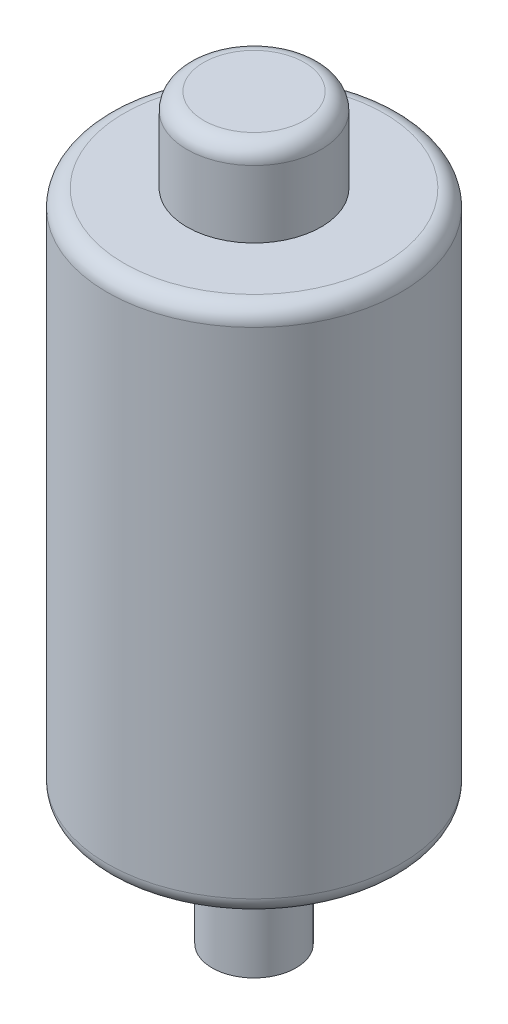
ISO-10303-21;
HEADER;
FILE_DESCRIPTION(('STEP AP214'),'2;1');
FILE_NAME('part.step','',(''),(''),'','','');
FILE_SCHEMA(('AUTOMOTIVE_DESIGN { 1 0 10303 214 1 1 1 1 }'));
ENDSEC;
DATA;
#1=APPLICATION_CONTEXT('core data for automotive mechanical design processes');
#2=APPLICATION_PROTOCOL_DEFINITION('international standard','automotive_design',2000,#1);
#3=PRODUCT_CONTEXT('',#1,'mechanical');
#4=PRODUCT('Part','Part','',(#3));
#5=PRODUCT_RELATED_PRODUCT_CATEGORY('part','',(#4));
#6=PRODUCT_DEFINITION_FORMATION('','',#4);
#7=PRODUCT_DEFINITION_CONTEXT('part definition',#1,'design');
#8=PRODUCT_DEFINITION('design','',#6,#7);
#9=PRODUCT_DEFINITION_SHAPE('','',#8);
#10=(LENGTH_UNIT() NAMED_UNIT(*) SI_UNIT(.MILLI.,.METRE.));
#11=(NAMED_UNIT(*) PLANE_ANGLE_UNIT() SI_UNIT($,.RADIAN.));
#12=(NAMED_UNIT(*) SI_UNIT($,.STERADIAN.) SOLID_ANGLE_UNIT());
#13=UNCERTAINTY_MEASURE_WITH_UNIT(LENGTH_MEASURE(1.E-05),#10,'distance_accuracy_value','');
#14=(GEOMETRIC_REPRESENTATION_CONTEXT(3) GLOBAL_UNCERTAINTY_ASSIGNED_CONTEXT((#13)) GLOBAL_UNIT_ASSIGNED_CONTEXT((#10,
#11,#12)) REPRESENTATION_CONTEXT('',''));
#15=CARTESIAN_POINT('',(0.,0.,0.));
#16=DIRECTION('',(0.,0.,1.));
#17=DIRECTION('',(1.,0.,0.));
#18=AXIS2_PLACEMENT_3D('',#15,#16,#17);
#19=CARTESIAN_POINT('',(0.,99.06,0.));
#20=DIRECTION('',(0.,1.,0.));
#21=DIRECTION('',(0.,0.,1.));
#22=AXIS2_PLACEMENT_3D('',#19,#20,#21);
#23=PLANE('',#22);
#24=CARTESIAN_POINT('',(0.,99.06,0.));
#25=DIRECTION('',(0.,1.,0.));
#26=DIRECTION('',(0.,0.,1.));
#27=AXIS2_PLACEMENT_3D('',#24,#25,#26);
#28=CIRCLE('',#27,19.685);
#29=CARTESIAN_POINT('',(0.,99.06,19.685));
#30=VERTEX_POINT('',#29);
#31=EDGE_CURVE('E55',#30,#30,#28,.T.);
#32=ORIENTED_EDGE('',*,*,#31,.T.);
#33=EDGE_LOOP('',(#32));
#34=FACE_BOUND('',#33,.T.);
#35=CARTESIAN_POINT('',(0.,99.06,0.));
#36=DIRECTION('',(0.,1.,0.));
#37=DIRECTION('',(0.,0.,1.));
#38=AXIS2_PLACEMENT_3D('',#35,#36,#37);
#39=CIRCLE('',#38,10.16);
#40=CARTESIAN_POINT('',(0.,99.06,10.16));
#41=VERTEX_POINT('',#40);
#42=EDGE_CURVE('E68',#41,#41,#39,.T.);
#43=ORIENTED_EDGE('',*,*,#42,.F.);
#44=EDGE_LOOP('',(#43));
#45=FACE_BOUND('',#44,.T.);
#46=ADVANCED_FACE('F31',(#34,#45),#23,.T.);
#47=CARTESIAN_POINT('',(0.,19.05,0.));
#48=DIRECTION('',(0.,-1.,0.));
#49=DIRECTION('',(0.,0.,-1.));
#50=AXIS2_PLACEMENT_3D('',#47,#48,#49);
#51=CYLINDRICAL_SURFACE('',#50,6.35);
#52=CARTESIAN_POINT('',(0.,19.05,0.));
#53=DIRECTION('',(0.,1.,0.));
#54=DIRECTION('',(0.,0.,1.));
#55=AXIS2_PLACEMENT_3D('',#52,#53,#54);
#56=CIRCLE('',#55,6.35);
#57=CARTESIAN_POINT('',(0.,19.05,-6.35));
#58=VERTEX_POINT('',#57);
#59=EDGE_CURVE('E64',#58,#58,#56,.T.);
#60=CARTESIAN_POINT('',(0.,0.,0.));
#61=DIRECTION('',(0.,1.,0.));
#62=DIRECTION('',(0.,0.,1.));
#63=AXIS2_PLACEMENT_3D('',#60,#61,#62);
#64=CIRCLE('',#63,6.35);
#65=CARTESIAN_POINT('',(0.,0.,-6.35));
#66=VERTEX_POINT('',#65);
#67=EDGE_CURVE('E65',#66,#66,#64,.T.);
#68=CARTESIAN_POINT('',(0.,19.05,-6.35));
#69=CARTESIAN_POINT('',(0.,18.8515625,-6.35));
#70=CARTESIAN_POINT('',(0.,18.653125,-6.35));
#71=CARTESIAN_POINT('',(0.,18.25625,-6.35));
#72=CARTESIAN_POINT('',(0.,18.0578125,-6.35));
#73=CARTESIAN_POINT('',(0.,17.6609375,-6.35));
#74=CARTESIAN_POINT('',(0.,17.4625,-6.35));
#75=CARTESIAN_POINT('',(0.,17.065625,-6.35));
#76=CARTESIAN_POINT('',(0.,16.8671875,-6.35));
#77=CARTESIAN_POINT('',(0.,16.4703125,-6.35));
#78=CARTESIAN_POINT('',(0.,16.271875,-6.35));
#79=CARTESIAN_POINT('',(0.,15.875,-6.35));
#80=CARTESIAN_POINT('',(0.,15.6765625,-6.35));
#81=CARTESIAN_POINT('',(0.,15.2796875,-6.35));
#82=CARTESIAN_POINT('',(0.,15.08125,-6.35));
#83=CARTESIAN_POINT('',(0.,14.684375,-6.35));
#84=CARTESIAN_POINT('',(0.,14.4859375,-6.35));
#85=CARTESIAN_POINT('',(0.,14.0890625,-6.35));
#86=CARTESIAN_POINT('',(0.,13.890625,-6.35));
#87=CARTESIAN_POINT('',(0.,13.49375,-6.35));
#88=CARTESIAN_POINT('',(0.,13.2953125,-6.35));
#89=CARTESIAN_POINT('',(0.,12.8984375,-6.35));
#90=CARTESIAN_POINT('',(0.,12.7,-6.35));
#91=CARTESIAN_POINT('',(0.,12.303125,-6.35));
#92=CARTESIAN_POINT('',(0.,12.1046875,-6.35));
#93=CARTESIAN_POINT('',(0.,11.7078125,-6.35));
#94=CARTESIAN_POINT('',(0.,11.509375,-6.35));
#95=CARTESIAN_POINT('',(0.,11.1125,-6.35));
#96=CARTESIAN_POINT('',(0.,10.9140625,-6.35));
#97=CARTESIAN_POINT('',(0.,10.5171875,-6.35));
#98=CARTESIAN_POINT('',(0.,10.31875,-6.35));
#99=CARTESIAN_POINT('',(0.,9.921875,-6.35));
#100=CARTESIAN_POINT('',(0.,9.7234375,-6.35));
#101=CARTESIAN_POINT('',(0.,9.3265625,-6.35));
#102=CARTESIAN_POINT('',(0.,9.128125,-6.35));
#103=CARTESIAN_POINT('',(0.,8.73125,-6.35));
#104=CARTESIAN_POINT('',(0.,8.5328125,-6.35));
#105=CARTESIAN_POINT('',(0.,8.1359375,-6.35));
#106=CARTESIAN_POINT('',(0.,7.9375,-6.35));
#107=CARTESIAN_POINT('',(0.,7.540625,-6.35));
#108=CARTESIAN_POINT('',(0.,7.3421875,-6.35));
#109=CARTESIAN_POINT('',(0.,6.9453125,-6.35));
#110=CARTESIAN_POINT('',(0.,6.746875,-6.35));
#111=CARTESIAN_POINT('',(0.,6.35,-6.35));
#112=CARTESIAN_POINT('',(0.,6.1515625,-6.35));
#113=CARTESIAN_POINT('',(0.,5.7546875,-6.35));
#114=CARTESIAN_POINT('',(0.,5.55625,-6.35));
#115=CARTESIAN_POINT('',(0.,5.159375,-6.35));
#116=CARTESIAN_POINT('',(0.,4.9609375,-6.35));
#117=CARTESIAN_POINT('',(0.,4.5640625,-6.35));
#118=CARTESIAN_POINT('',(0.,4.365625,-6.35));
#119=CARTESIAN_POINT('',(0.,3.96875,-6.35));
#120=CARTESIAN_POINT('',(0.,3.7703125,-6.35));
#121=CARTESIAN_POINT('',(0.,3.3734375,-6.35));
#122=CARTESIAN_POINT('',(0.,3.175,-6.35));
#123=CARTESIAN_POINT('',(0.,2.778125,-6.35));
#124=CARTESIAN_POINT('',(0.,2.5796875,-6.35));
#125=CARTESIAN_POINT('',(0.,2.1828125,-6.35));
#126=CARTESIAN_POINT('',(0.,1.984375,-6.35));
#127=CARTESIAN_POINT('',(0.,1.5875,-6.35));
#128=CARTESIAN_POINT('',(0.,1.3890625,-6.35));
#129=CARTESIAN_POINT('',(0.,0.992187500000001,-6.35));
#130=CARTESIAN_POINT('',(0.,0.793750000000001,-6.35));
#131=CARTESIAN_POINT('',(0.,0.396875,-6.35));
#132=CARTESIAN_POINT('',(0.,0.1984375,-6.35));
#133=CARTESIAN_POINT('',(0.,0.,-6.35));
#134=B_SPLINE_CURVE_WITH_KNOTS('',3,(#68,#69,#70,#71,#72,#73,#74,#75,#76,#77,#78,#79,#80,#81,
#82,#83,#84,#85,#86,#87,#88,#89,#90,#91,#92,#93,#94,#95,#96,#97,#98,#99,#100,#101,#102,#103,
#104,#105,#106,#107,#108,#109,#110,#111,#112,#113,#114,#115,#116,#117,#118,#119,#120,#121,#122,
#123,#124,#125,#126,#127,#128,#129,#130,#131,#132,#133),.UNSPECIFIED.,.F.,.F.,(4,2,2,2,2,2,2,2,
2,2,2,2,2,2,2,2,2,2,2,2,2,2,2,2,2,2,2,2,2,2,2,2,4),(0.,0.5953125,1.190625,1.7859375,2.38125,
2.9765625,3.571875,4.1671875,4.7625,5.3578125,5.953125,6.5484375,7.14375,7.7390625,8.334375,
8.9296875,9.525,10.1203125,10.715625,11.3109375,11.90625,12.5015625,13.096875,13.6921875,
14.2875,14.8828125,15.478125,16.0734375,16.66875,17.2640625,17.859375,18.4546875,19.05),.UNSPECIFIED.);
#135=EDGE_CURVE('BSEAM92',#58,#66,#134,.T.);
#136=ORIENTED_EDGE('',*,*,#59,.F.);
#137=ORIENTED_EDGE('',*,*,#67,.T.);
#138=ORIENTED_EDGE('',*,*,#135,.T.);
#139=ORIENTED_EDGE('',*,*,#135,.F.);
#140=EDGE_LOOP('',(#136,#138,#137,#139));
#141=FACE_BOUND('',#140,.T.);
#142=ADVANCED_FACE('F92',(#141),#51,.T.);
#143=CARTESIAN_POINT('',(0.,0.,0.));
#144=DIRECTION('',(0.,1.,0.));
#145=DIRECTION('',(0.,0.,1.));
#146=AXIS2_PLACEMENT_3D('',#143,#144,#145);
#147=PLANE('',#146);
#148=ORIENTED_EDGE('',*,*,#67,.F.);
#149=EDGE_LOOP('',(#148));
#150=FACE_BOUND('',#149,.T.);
#151=ADVANCED_FACE('F98',(#150),#147,.F.);
#152=CARTESIAN_POINT('',(0.,19.05,0.));
#153=DIRECTION('',(0.,1.,0.));
#154=DIRECTION('',(0.,0.,1.));
#155=AXIS2_PLACEMENT_3D('',#152,#153,#154);
#156=PLANE('',#155);
#157=CARTESIAN_POINT('',(0.,19.05,0.));
#158=DIRECTION('',(0.,1.,0.));
#159=DIRECTION('',(0.,0.,1.));
#160=AXIS2_PLACEMENT_3D('',#157,#158,#159);
#161=CIRCLE('',#160,19.685);
#162=CARTESIAN_POINT('',(0.,19.05,19.685));
#163=VERTEX_POINT('',#162);
#164=EDGE_CURVE('E42',#163,#163,#161,.F.);
#165=ORIENTED_EDGE('',*,*,#164,.T.);
#166=EDGE_LOOP('',(#165));
#167=FACE_BOUND('',#166,.T.);
#168=ORIENTED_EDGE('',*,*,#59,.T.);
#169=EDGE_LOOP('',(#168));
#170=FACE_BOUND('',#169,.T.);
#171=ADVANCED_FACE('F105',(#167,#170),#156,.F.);
#172=CARTESIAN_POINT('',(0.,99.06,0.));
#173=DIRECTION('',(0.,-1.,0.));
#174=DIRECTION('',(0.,0.,-1.));
#175=AXIS2_PLACEMENT_3D('',#172,#173,#174);
#176=CYLINDRICAL_SURFACE('',#175,22.225);
#177=CARTESIAN_POINT('',(0.,21.59,0.));
#178=DIRECTION('',(0.,1.,0.));
#179=DIRECTION('',(0.,0.,1.));
#180=AXIS2_PLACEMENT_3D('',#177,#178,#179);
#181=CIRCLE('',#180,22.225);
#182=CARTESIAN_POINT('',(0.,21.59,22.225));
#183=VERTEX_POINT('',#182);
#184=EDGE_CURVE('E46',#183,#183,#181,.T.);
#185=ORIENTED_EDGE('',*,*,#184,.T.);
#186=EDGE_LOOP('',(#185));
#187=FACE_BOUND('',#186,.T.);
#188=CARTESIAN_POINT('',(0.,96.52,0.));
#189=DIRECTION('',(0.,1.,0.));
#190=DIRECTION('',(0.,0.,1.));
#191=AXIS2_PLACEMENT_3D('',#188,#189,#190);
#192=CIRCLE('',#191,22.225);
#193=CARTESIAN_POINT('',(0.,96.52,22.225));
#194=VERTEX_POINT('',#193);
#195=EDGE_CURVE('E50',#194,#194,#192,.F.);
#196=ORIENTED_EDGE('',*,*,#195,.T.);
#197=EDGE_LOOP('',(#196));
#198=FACE_BOUND('',#197,.T.);
#199=ADVANCED_FACE('F108',(#187,#198),#176,.T.);
#200=CARTESIAN_POINT('',(0.,111.76,0.));
#201=DIRECTION('',(0.,-1.,0.));
#202=DIRECTION('',(0.,0.,-1.));
#203=AXIS2_PLACEMENT_3D('',#200,#201,#202);
#204=CYLINDRICAL_SURFACE('',#203,10.16);
#205=CARTESIAN_POINT('',(0.,105.479909704344,-10.16));
#206=CARTESIAN_POINT('',(-0.0531593185506955,105.479907393677,-10.1599994250393));
#207=CARTESIAN_POINT('',(-0.106354221174143,105.475426129735,-10.1595783491074));
#208=CARTESIAN_POINT('',(-0.211270504574962,105.457616435964,-10.1579390817006));
#209=CARTESIAN_POINT('',(-0.262990175520519,105.444278143111,-10.1567200016045));
#210=CARTESIAN_POINT('',(-0.363421421795611,105.409144982555,-10.1536224010009));
#211=CARTESIAN_POINT('',(-0.412134746365796,105.387355087222,-10.1517442682986));
#212=CARTESIAN_POINT('',(-0.505201490225903,105.335946598442,-10.147538828102));
#213=CARTESIAN_POINT('',(-0.549555801411844,105.306329611088,-10.1452116127843));
#214=CARTESIAN_POINT('',(-0.632796617039149,105.24000703371,-10.1403606687467));
#215=CARTESIAN_POINT('',(-0.671667432692107,105.203281790024,-10.1378364070335));
#216=CARTESIAN_POINT('',(-0.742703102845569,105.123826978547,-10.1328803043109));
#217=CARTESIAN_POINT('',(-0.774867653840123,105.081097139153,-10.1304484674884));
#218=CARTESIAN_POINT('',(-0.83163239828387,104.990749093739,-10.1259470064525));
#219=CARTESIAN_POINT('',(-0.856218550208229,104.94312202904,-10.1238780576301));
#220=CARTESIAN_POINT('',(-0.897038915498141,104.844393044545,-10.1203430501911));
#221=CARTESIAN_POINT('',(-0.913273310423322,104.793291200315,-10.1188769784686));
#222=CARTESIAN_POINT('',(-0.93688319437106,104.689222223848,-10.1167184143099));
#223=CARTESIAN_POINT('',(-0.944284534645602,104.636261004015,-10.116023664902));
#224=CARTESIAN_POINT('',(-0.950098103253231,104.529843816231,-10.1154793545626));
#225=CARTESIAN_POINT('',(-0.948510539456025,104.476387859749,-10.1156297740863));
#226=CARTESIAN_POINT('',(-0.936412695631222,104.370676378755,-10.1167567486195));
#227=CARTESIAN_POINT('',(-0.925930586353633,104.318417598617,-10.1177306953244));
#228=CARTESIAN_POINT('',(-0.896385005238487,104.216404324864,-10.1203909044883));
#229=CARTESIAN_POINT('',(-0.877321430901722,104.166649861169,-10.1220771754554));
#230=CARTESIAN_POINT('',(-0.831122782357275,104.070968246578,-10.1259750361292));
#231=CARTESIAN_POINT('',(-0.803975150816726,104.025047193428,-10.1281874420203));
#232=CARTESIAN_POINT('',(-0.742388044492957,103.938402637923,-10.1328875756219));
#233=CARTESIAN_POINT('',(-0.707948383846391,103.89767926809,-10.1353753103494));
#234=CARTESIAN_POINT('',(-0.632597216817149,103.822422325505,-10.1403574134606));
#235=CARTESIAN_POINT('',(-0.591661370980325,103.787913117245,-10.1428517706437));
#236=CARTESIAN_POINT('',(-0.504564534486979,103.726252736802,-10.147557016896));
#237=CARTESIAN_POINT('',(-0.45840353905079,103.699101571349,-10.1497679057058));
#238=CARTESIAN_POINT('',(-0.362150301468057,103.652929202015,-10.1536577016658));
#239=CARTESIAN_POINT('',(-0.312057494667944,103.633909168396,-10.1553365322312));
#240=CARTESIAN_POINT('',(-0.209370254345753,103.604556492791,-10.1579722357421));
#241=CARTESIAN_POINT('',(-0.156775886054045,103.59422362441,-10.1589291275019));
#242=CARTESIAN_POINT('',(-0.0507895604589249,103.582569348907,-10.1600107225322));
#243=CARTESIAN_POINT('',(0.00259866799588939,103.581214306992,-10.1601385318639));
#244=CARTESIAN_POINT('',(0.108842609594824,103.587465904453,-10.1595558763121));
#245=CARTESIAN_POINT('',(0.161698328988698,103.595072438527,-10.1588454212785));
#246=CARTESIAN_POINT('',(0.265280286394605,103.619003373335,-10.1566680909285));
#247=CARTESIAN_POINT('',(0.316010178542009,103.635312091888,-10.1552025764656));
#248=CARTESIAN_POINT('',(0.414013866115186,103.67616837646,-10.151679628711));
#249=CARTESIAN_POINT('',(0.461287593519401,103.700716104581,-10.1496221837734));
#250=CARTESIAN_POINT('',(0.551189515035499,103.75743746844,-10.1451379808471));
#251=CARTESIAN_POINT('',(0.593803663866522,103.789633279946,-10.1427101564003));
#252=CARTESIAN_POINT('',(0.673034761453943,103.860704994042,-10.1377612485229));
#253=CARTESIAN_POINT('',(0.709651579208678,103.899581042512,-10.1352401630566));
#254=CARTESIAN_POINT('',(0.775964791088397,103.983056106174,-10.1303795913868));
#255=CARTESIAN_POINT('',(0.805639163108435,104.027672655262,-10.1280406983553));
#256=CARTESIAN_POINT('',(0.857073912493453,104.121275406205,-10.1238181109344));
#257=CARTESIAN_POINT('',(0.878834385968203,104.170261554985,-10.121934411017));
#258=CARTESIAN_POINT('',(0.913786499295647,104.271136416369,-10.1188390513698));
#259=CARTESIAN_POINT('',(0.926991400534054,104.323020500821,-10.1176263519976));
#260=CARTESIAN_POINT('',(0.944500622607014,104.428281299596,-10.1160069750266));
#261=CARTESIAN_POINT('',(0.948805163144033,104.481657977042,-10.1156002775319));
#262=CARTESIAN_POINT('',(0.948388642334171,104.588169927965,-10.1156393203215));
#263=CARTESIAN_POINT('',(0.943702177350257,104.641305341334,-10.1160817930978));
#264=CARTESIAN_POINT('',(0.925509048854184,104.74603067412,-10.1177623645526));
#265=CARTESIAN_POINT('',(0.912002373819691,104.797620591517,-10.1190004642705));
#266=CARTESIAN_POINT('',(0.876561457632779,104.897791256813,-10.122131900824));
#267=CARTESIAN_POINT('',(0.854628072050808,104.946372309623,-10.1240251711376));
#268=CARTESIAN_POINT('',(0.802960014778908,105.039168668344,-10.1282537559089));
#269=CARTESIAN_POINT('',(0.773225419675142,105.083384017107,-10.130589066027));
#270=CARTESIAN_POINT('',(0.706668942088032,105.166371118086,-10.1354493398895));
#271=CARTESIAN_POINT('',(0.669821327115515,105.205122193767,-10.1379749712881));
#272=CARTESIAN_POINT('',(0.590134308774014,105.275907181872,-10.1429252008936));
#273=CARTESIAN_POINT('',(0.54729346637285,105.307939476421,-10.1453497746534));
#274=CARTESIAN_POINT('',(0.456733167779498,105.364432304203,-10.1498302078351));
#275=CARTESIAN_POINT('',(0.409003003480699,105.388875724246,-10.1518852295787));
#276=CARTESIAN_POINT('',(0.310127983054372,105.42936910106,-10.1553856517539));
#277=CARTESIAN_POINT('',(0.258987083594796,105.445428599082,-10.1568317448075));
#278=CARTESIAN_POINT('',(0.172959557419439,105.464657785517,-10.1585847019684));
#279=CARTESIAN_POINT('',(0.1386243061048,105.470369530119,-10.1591129885828));
#280=CARTESIAN_POINT('',(0.0695311108729364,105.477996238659,-10.1598208250411));
#281=CARTESIAN_POINT('',(0.0347731684285115,105.479911215823,-10.1600003760998));
#282=CARTESIAN_POINT('',(0.,105.479909704344,-10.16));
#283=B_SPLINE_CURVE_WITH_KNOTS('',3,(#205,#206,#207,#208,#209,#210,#211,#212,#213,#214,#215,
#216,#217,#218,#219,#220,#221,#222,#223,#224,#225,#226,#227,#228,#229,#230,#231,#232,#233,#234,
#235,#236,#237,#238,#239,#240,#241,#242,#243,#244,#245,#246,#247,#248,#249,#250,#251,#252,#253,
#254,#255,#256,#257,#258,#259,#260,#261,#262,#263,#264,#265,#266,#267,#268,#269,#270,#271,#272,
#273,#274,#275,#276,#277,#278,#279,#280,#281,#282),.UNSPECIFIED.,.T.,.F.,(4,2,2,2,2,2,2,2,2,2,2,
2,2,2,2,2,2,2,2,2,2,2,2,2,2,2,2,2,2,2,2,2,2,2,2,2,2,2,4),(0.,0.159350984903501,
0.318879718388187,0.478314737627176,0.637717066713253,0.797566592099744,0.957423350239329,
1.11757454049686,1.27772224906554,1.43740010301534,1.59707426440677,1.75624458629287,
1.91541680940036,2.07483758327567,2.2342624210467,2.39429933205183,2.55433638945073,
2.71439647222133,2.87445238357318,3.03390831601493,3.19336237482835,3.3525300476524,
3.51170085224846,3.67133893354027,3.83098050139398,3.99112180200832,4.15126115773327,
4.31115169517711,4.47103828572868,4.6303108846623,4.78958369166301,4.94884033184397,
5.10809540862655,5.26793779503171,5.42781862723241,5.58805742090398,5.74811345643875,
5.85235026928959,5.95658671904795),.UNSPECIFIED.);
#284=CARTESIAN_POINT('',(0.,105.479909704344,-10.16));
#285=VERTEX_POINT('',#284);
#286=EDGE_CURVE('E10',#285,#285,#283,.T.);
#287=ORIENTED_EDGE('',*,*,#286,.T.);
#288=EDGE_LOOP('',(#287));
#289=FACE_BOUND('',#288,.T.);
#290=CARTESIAN_POINT('',(0.,109.22,0.));
#291=DIRECTION('',(0.,1.,0.));
#292=DIRECTION('',(0.,0.,1.));
#293=AXIS2_PLACEMENT_3D('',#290,#291,#292);
#294=CIRCLE('',#293,10.16);
#295=CARTESIAN_POINT('',(0.,109.22,10.16));
#296=VERTEX_POINT('',#295);
#297=EDGE_CURVE('E58',#296,#296,#294,.F.);
#298=ORIENTED_EDGE('',*,*,#297,.T.);
#299=EDGE_LOOP('',(#298));
#300=FACE_BOUND('',#299,.T.);
#301=ORIENTED_EDGE('',*,*,#42,.T.);
#302=EDGE_LOOP('',(#301));
#303=FACE_BOUND('',#302,.T.);
#304=ADVANCED_FACE('F103',(#289,#300,#303),#204,.T.);
#305=CARTESIAN_POINT('',(0.,111.76,0.));
#306=DIRECTION('',(0.,1.,0.));
#307=DIRECTION('',(0.,0.,1.));
#308=AXIS2_PLACEMENT_3D('',#305,#306,#307);
#309=PLANE('',#308);
#310=CARTESIAN_POINT('',(0.,111.76,0.));
#311=DIRECTION('',(0.,1.,0.));
#312=DIRECTION('',(0.,0.,1.));
#313=AXIS2_PLACEMENT_3D('',#310,#311,#312);
#314=CIRCLE('',#313,7.62);
#315=CARTESIAN_POINT('',(0.,111.76,7.62));
#316=VERTEX_POINT('',#315);
#317=EDGE_CURVE('E61',#316,#316,#314,.T.);
#318=ORIENTED_EDGE('',*,*,#317,.T.);
#319=EDGE_LOOP('',(#318));
#320=FACE_BOUND('',#319,.T.);
#321=ADVANCED_FACE('F117',(#320),#309,.T.);
#322=CARTESIAN_POINT('',(0.,109.22,0.));
#323=DIRECTION('',(0.,1.,0.));
#324=DIRECTION('',(0.,0.,1.));
#325=AXIS2_PLACEMENT_3D('',#322,#323,#324);
#326=TOROIDAL_SURFACE('',#325,7.62,2.54);
#327=ORIENTED_EDGE('',*,*,#297,.F.);
#328=EDGE_LOOP('',(#327));
#329=FACE_BOUND('',#328,.T.);
#330=ORIENTED_EDGE('',*,*,#317,.F.);
#331=EDGE_LOOP('',(#330));
#332=FACE_BOUND('',#331,.T.);
#333=ADVANCED_FACE('F115',(#329,#332),#326,.T.);
#334=CARTESIAN_POINT('',(0.,96.52,0.));
#335=DIRECTION('',(0.,1.,0.));
#336=DIRECTION('',(0.,0.,1.));
#337=AXIS2_PLACEMENT_3D('',#334,#335,#336);
#338=TOROIDAL_SURFACE('',#337,19.685,2.54);
#339=ORIENTED_EDGE('',*,*,#195,.F.);
#340=EDGE_LOOP('',(#339));
#341=FACE_BOUND('',#340,.T.);
#342=ORIENTED_EDGE('',*,*,#31,.F.);
#343=EDGE_LOOP('',(#342));
#344=FACE_BOUND('',#343,.T.);
#345=ADVANCED_FACE('F87',(#341,#344),#338,.T.);
#346=CARTESIAN_POINT('',(0.,21.59,0.));
#347=DIRECTION('',(0.,1.,0.));
#348=DIRECTION('',(0.,0.,1.));
#349=AXIS2_PLACEMENT_3D('',#346,#347,#348);
#350=TOROIDAL_SURFACE('',#349,19.685,2.54);
#351=ORIENTED_EDGE('',*,*,#164,.F.);
#352=EDGE_LOOP('',(#351));
#353=FACE_BOUND('',#352,.T.);
#354=ORIENTED_EDGE('',*,*,#184,.F.);
#355=EDGE_LOOP('',(#354));
#356=FACE_BOUND('',#355,.T.);
#357=ADVANCED_FACE('F33',(#353,#356),#350,.T.);
#358=CARTESIAN_POINT('',(0.,104.5313059455,-7.62));
#359=DIRECTION('',(0.,0.,-1.));
#360=DIRECTION('',(-1.,0.,0.));
#361=AXIS2_PLACEMENT_3D('',#358,#359,#360);
#362=CYLINDRICAL_SURFACE('',#361,0.948603758843913);
#363=CARTESIAN_POINT('',(0.,104.5313059455,-7.62));
#364=DIRECTION('',(0.,0.,-1.));
#365=DIRECTION('',(-1.,0.,0.));
#366=AXIS2_PLACEMENT_3D('',#363,#364,#365);
#367=CIRCLE('',#366,0.948603758843913);
#368=CARTESIAN_POINT('',(-0.948603758843913,104.5313059455,-7.62));
#369=VERTEX_POINT('',#368);
#370=EDGE_CURVE('E73',#369,#369,#367,.T.);
#371=ORIENTED_EDGE('',*,*,#370,.F.);
#372=EDGE_LOOP('',(#371));
#373=FACE_BOUND('',#372,.T.);
#374=ORIENTED_EDGE('',*,*,#286,.F.);
#375=EDGE_LOOP('',(#374));
#376=FACE_BOUND('',#375,.T.);
#377=ADVANCED_FACE('F79',(#373,#376),#362,.F.);
#378=CARTESIAN_POINT('',(0.,104.5313059455,-7.62));
#379=DIRECTION('',(0.,0.,-1.));
#380=DIRECTION('',(-1.,0.,0.));
#381=AXIS2_PLACEMENT_3D('',#378,#379,#380);
#382=PLANE('',#381);
#383=ORIENTED_EDGE('',*,*,#370,.T.);
#384=EDGE_LOOP('',(#383));
#385=FACE_BOUND('',#384,.T.);
#386=ADVANCED_FACE('F77',(#385),#382,.T.);
#387=CLOSED_SHELL('',(#46,#142,#151,#171,#199,#304,#321,#333,#345,#357,#377,#386));
#388=MANIFOLD_SOLID_BREP('B2',#387);
#389=ADVANCED_BREP_SHAPE_REPRESENTATION('',(#18,#388),#14);
#390=SHAPE_DEFINITION_REPRESENTATION(#9,#389);
ENDSEC;
END-ISO-10303-21;
